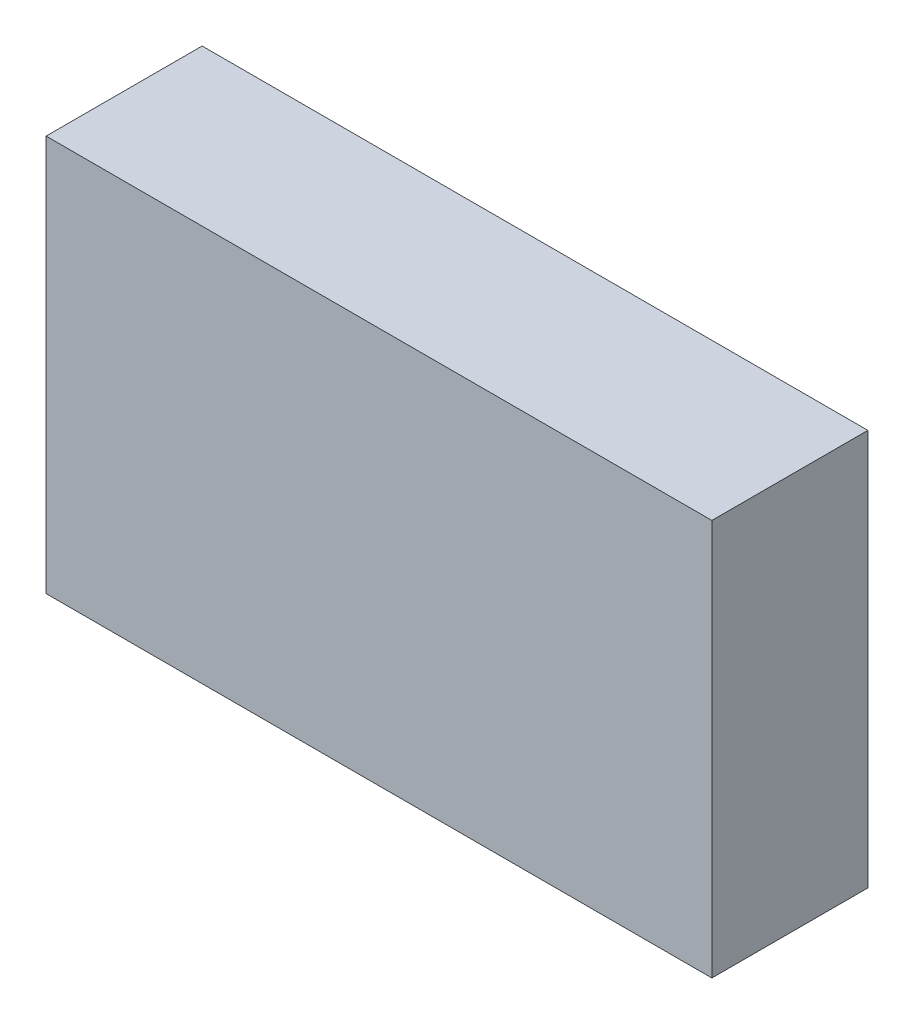
ISO-10303-21;
HEADER;
FILE_DESCRIPTION(('STEP AP214'),'2;1');
FILE_NAME('part.step','',(''),(''),'','','');
FILE_SCHEMA(('AUTOMOTIVE_DESIGN { 1 0 10303 214 1 1 1 1 }'));
ENDSEC;
DATA;
#1=APPLICATION_CONTEXT('core data for automotive mechanical design processes');
#2=APPLICATION_PROTOCOL_DEFINITION('international standard','automotive_design',2000,#1);
#3=PRODUCT_CONTEXT('',#1,'mechanical');
#4=PRODUCT('Part','Part','',(#3));
#5=PRODUCT_RELATED_PRODUCT_CATEGORY('part','',(#4));
#6=PRODUCT_DEFINITION_FORMATION('','',#4);
#7=PRODUCT_DEFINITION_CONTEXT('part definition',#1,'design');
#8=PRODUCT_DEFINITION('design','',#6,#7);
#9=PRODUCT_DEFINITION_SHAPE('','',#8);
#10=(LENGTH_UNIT() NAMED_UNIT(*) SI_UNIT(.MILLI.,.METRE.));
#11=(NAMED_UNIT(*) PLANE_ANGLE_UNIT() SI_UNIT($,.RADIAN.));
#12=(NAMED_UNIT(*) SI_UNIT($,.STERADIAN.) SOLID_ANGLE_UNIT());
#13=UNCERTAINTY_MEASURE_WITH_UNIT(LENGTH_MEASURE(1.E-05),#10,'distance_accuracy_value','');
#14=(GEOMETRIC_REPRESENTATION_CONTEXT(3) GLOBAL_UNCERTAINTY_ASSIGNED_CONTEXT((#13)) GLOBAL_UNIT_ASSIGNED_CONTEXT((#10,
#11,#12)) REPRESENTATION_CONTEXT('',''));
#15=CARTESIAN_POINT('',(0.,0.,0.));
#16=DIRECTION('',(0.,0.,1.));
#17=DIRECTION('',(1.,0.,0.));
#18=AXIS2_PLACEMENT_3D('',#15,#16,#17);
#19=CARTESIAN_POINT('',(-1.778,-1.27,1.));
#20=DIRECTION('',(1.,0.,0.));
#21=DIRECTION('',(0.,0.,-1.));
#22=AXIS2_PLACEMENT_3D('',#19,#20,#21);
#23=PLANE('',#22);
#24=DIRECTION('',(0.,-1.,0.));
#25=VECTOR('',#24,1.);
#26=CARTESIAN_POINT('',(-1.778,-1.27,0.));
#27=LINE('',#26,#25);
#28=CARTESIAN_POINT('',(-1.778,1.27,0.));
#29=VERTEX_POINT('',#28);
#30=CARTESIAN_POINT('',(-1.778,-1.27,0.));
#31=VERTEX_POINT('',#30);
#32=EDGE_CURVE('E95',#29,#31,#27,.T.);
#33=ORIENTED_EDGE('',*,*,#32,.T.);
#34=DIRECTION('',(0.,0.,-1.));
#35=VECTOR('',#34,1.);
#36=CARTESIAN_POINT('',(-1.778,-1.27,1.));
#37=LINE('',#36,#35);
#38=CARTESIAN_POINT('',(-1.778,-1.27,1.));
#39=VERTEX_POINT('',#38);
#40=EDGE_CURVE('E11',#39,#31,#37,.T.);
#41=ORIENTED_EDGE('',*,*,#40,.F.);
#42=DIRECTION('',(0.,-1.,0.));
#43=VECTOR('',#42,1.);
#44=CARTESIAN_POINT('',(-1.778,-1.27,1.));
#45=LINE('',#44,#43);
#46=CARTESIAN_POINT('',(-1.778,1.27,1.));
#47=VERTEX_POINT('',#46);
#48=EDGE_CURVE('E83',#47,#39,#45,.T.);
#49=ORIENTED_EDGE('',*,*,#48,.F.);
#50=DIRECTION('',(0.,0.,-1.));
#51=VECTOR('',#50,1.);
#52=CARTESIAN_POINT('',(-1.778,1.27,1.));
#53=LINE('',#52,#51);
#54=EDGE_CURVE('E91',#47,#29,#53,.T.);
#55=ORIENTED_EDGE('',*,*,#54,.T.);
#56=EDGE_LOOP('',(#33,#41,#49,#55));
#57=FACE_BOUND('',#56,.T.);
#58=ADVANCED_FACE('F32',(#57),#23,.F.);
#59=CARTESIAN_POINT('',(2.4892,-1.27,1.));
#60=DIRECTION('',(0.,1.,0.));
#61=DIRECTION('',(0.,0.,1.));
#62=AXIS2_PLACEMENT_3D('',#59,#60,#61);
#63=PLANE('',#62);
#64=DIRECTION('',(1.,0.,0.));
#65=VECTOR('',#64,1.);
#66=CARTESIAN_POINT('',(2.4892,-1.27,0.));
#67=LINE('',#66,#65);
#68=CARTESIAN_POINT('',(2.4892,-1.27,0.));
#69=VERTEX_POINT('',#68);
#70=EDGE_CURVE('E87',#31,#69,#67,.T.);
#71=ORIENTED_EDGE('',*,*,#70,.T.);
#72=DIRECTION('',(0.,0.,-1.));
#73=VECTOR('',#72,1.);
#74=CARTESIAN_POINT('',(2.4892,-1.27,1.));
#75=LINE('',#74,#73);
#76=CARTESIAN_POINT('',(2.4892,-1.27,1.));
#77=VERTEX_POINT('',#76);
#78=EDGE_CURVE('E40',#77,#69,#75,.T.);
#79=ORIENTED_EDGE('',*,*,#78,.F.);
#80=DIRECTION('',(1.,0.,0.));
#81=VECTOR('',#80,1.);
#82=CARTESIAN_POINT('',(2.4892,-1.27,1.));
#83=LINE('',#82,#81);
#84=EDGE_CURVE('E78',#39,#77,#83,.T.);
#85=ORIENTED_EDGE('',*,*,#84,.F.);
#86=ORIENTED_EDGE('',*,*,#40,.T.);
#87=EDGE_LOOP('',(#71,#79,#85,#86));
#88=FACE_BOUND('',#87,.T.);
#89=ADVANCED_FACE('F86',(#88),#63,.F.);
#90=CARTESIAN_POINT('',(2.4892,1.27,1.));
#91=DIRECTION('',(-1.,0.,0.));
#92=DIRECTION('',(0.,0.,1.));
#93=AXIS2_PLACEMENT_3D('',#90,#91,#92);
#94=PLANE('',#93);
#95=DIRECTION('',(0.,1.,0.));
#96=VECTOR('',#95,1.);
#97=CARTESIAN_POINT('',(2.4892,1.27,0.));
#98=LINE('',#97,#96);
#99=CARTESIAN_POINT('',(2.4892,1.27,0.));
#100=VERTEX_POINT('',#99);
#101=EDGE_CURVE('E65',#69,#100,#98,.T.);
#102=ORIENTED_EDGE('',*,*,#101,.T.);
#103=DIRECTION('',(0.,0.,-1.));
#104=VECTOR('',#103,1.);
#105=CARTESIAN_POINT('',(2.4892,1.27,1.));
#106=LINE('',#105,#104);
#107=CARTESIAN_POINT('',(2.4892,1.27,1.));
#108=VERTEX_POINT('',#107);
#109=EDGE_CURVE('E88',#108,#100,#106,.T.);
#110=ORIENTED_EDGE('',*,*,#109,.F.);
#111=DIRECTION('',(0.,1.,0.));
#112=VECTOR('',#111,1.);
#113=CARTESIAN_POINT('',(2.4892,1.27,1.));
#114=LINE('',#113,#112);
#115=EDGE_CURVE('E81',#77,#108,#114,.T.);
#116=ORIENTED_EDGE('',*,*,#115,.F.);
#117=ORIENTED_EDGE('',*,*,#78,.T.);
#118=EDGE_LOOP('',(#102,#110,#116,#117));
#119=FACE_BOUND('',#118,.T.);
#120=ADVANCED_FACE('F89',(#119),#94,.F.);
#121=CARTESIAN_POINT('',(-1.778,1.27,1.));
#122=DIRECTION('',(0.,-1.,0.));
#123=DIRECTION('',(0.,0.,-1.));
#124=AXIS2_PLACEMENT_3D('',#121,#122,#123);
#125=PLANE('',#124);
#126=DIRECTION('',(-1.,0.,0.));
#127=VECTOR('',#126,1.);
#128=CARTESIAN_POINT('',(-1.778,1.27,0.));
#129=LINE('',#128,#127);
#130=EDGE_CURVE('E71',#100,#29,#129,.T.);
#131=ORIENTED_EDGE('',*,*,#130,.T.);
#132=ORIENTED_EDGE('',*,*,#54,.F.);
#133=DIRECTION('',(-1.,0.,0.));
#134=VECTOR('',#133,1.);
#135=CARTESIAN_POINT('',(-1.778,1.27,1.));
#136=LINE('',#135,#134);
#137=EDGE_CURVE('E48',#108,#47,#136,.T.);
#138=ORIENTED_EDGE('',*,*,#137,.F.);
#139=ORIENTED_EDGE('',*,*,#109,.T.);
#140=EDGE_LOOP('',(#131,#132,#138,#139));
#141=FACE_BOUND('',#140,.T.);
#142=ADVANCED_FACE('F102',(#141),#125,.F.);
#143=CARTESIAN_POINT('',(0.,0.,1.));
#144=DIRECTION('',(0.,0.,-1.));
#145=DIRECTION('',(-1.,0.,0.));
#146=AXIS2_PLACEMENT_3D('',#143,#144,#145);
#147=PLANE('',#146);
#148=ORIENTED_EDGE('',*,*,#48,.T.);
#149=ORIENTED_EDGE('',*,*,#84,.T.);
#150=ORIENTED_EDGE('',*,*,#115,.T.);
#151=ORIENTED_EDGE('',*,*,#137,.T.);
#152=EDGE_LOOP('',(#148,#149,#150,#151));
#153=FACE_BOUND('',#152,.T.);
#154=ADVANCED_FACE('F79',(#153),#147,.F.);
#155=CARTESIAN_POINT('',(0.,0.,0.));
#156=DIRECTION('',(0.,0.,-1.));
#157=DIRECTION('',(-1.,0.,0.));
#158=AXIS2_PLACEMENT_3D('',#155,#156,#157);
#159=PLANE('',#158);
#160=ORIENTED_EDGE('',*,*,#32,.F.);
#161=ORIENTED_EDGE('',*,*,#130,.F.);
#162=ORIENTED_EDGE('',*,*,#101,.F.);
#163=ORIENTED_EDGE('',*,*,#70,.F.);
#164=EDGE_LOOP('',(#160,#161,#162,#163));
#165=FACE_BOUND('',#164,.T.);
#166=ADVANCED_FACE('F105',(#165),#159,.T.);
#167=CLOSED_SHELL('',(#58,#89,#120,#142,#154,#166));
#168=MANIFOLD_SOLID_BREP('B2',#167);
#169=ADVANCED_BREP_SHAPE_REPRESENTATION('',(#18,#168),#14);
#170=SHAPE_DEFINITION_REPRESENTATION(#9,#169);
ENDSEC;
END-ISO-10303-21;
